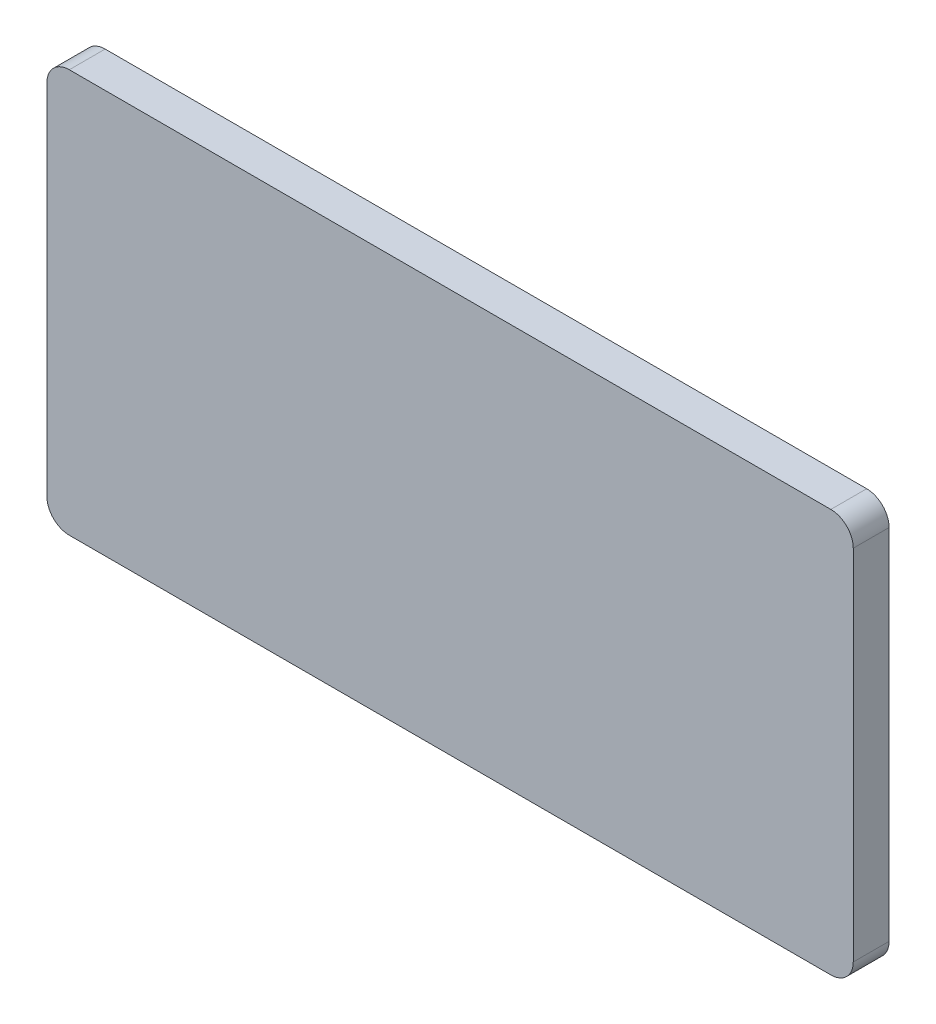
ISO-10303-21;
HEADER;
FILE_DESCRIPTION(('STEP AP214'),'2;1');
FILE_NAME('part.step','',(''),(''),'','','');
FILE_SCHEMA(('AUTOMOTIVE_DESIGN { 1 0 10303 214 1 1 1 1 }'));
ENDSEC;
DATA;
#1=APPLICATION_CONTEXT('core data for automotive mechanical design processes');
#2=APPLICATION_PROTOCOL_DEFINITION('international standard','automotive_design',2000,#1);
#3=PRODUCT_CONTEXT('',#1,'mechanical');
#4=PRODUCT('Part','Part','',(#3));
#5=PRODUCT_RELATED_PRODUCT_CATEGORY('part','',(#4));
#6=PRODUCT_DEFINITION_FORMATION('','',#4);
#7=PRODUCT_DEFINITION_CONTEXT('part definition',#1,'design');
#8=PRODUCT_DEFINITION('design','',#6,#7);
#9=PRODUCT_DEFINITION_SHAPE('','',#8);
#10=(LENGTH_UNIT() NAMED_UNIT(*) SI_UNIT(.MILLI.,.METRE.));
#11=(NAMED_UNIT(*) PLANE_ANGLE_UNIT() SI_UNIT($,.RADIAN.));
#12=(NAMED_UNIT(*) SI_UNIT($,.STERADIAN.) SOLID_ANGLE_UNIT());
#13=UNCERTAINTY_MEASURE_WITH_UNIT(LENGTH_MEASURE(1.E-05),#10,'distance_accuracy_value','');
#14=(GEOMETRIC_REPRESENTATION_CONTEXT(3) GLOBAL_UNCERTAINTY_ASSIGNED_CONTEXT((#13)) GLOBAL_UNIT_ASSIGNED_CONTEXT((#10,
#11,#12)) REPRESENTATION_CONTEXT('',''));
#15=CARTESIAN_POINT('',(0.,0.,0.));
#16=DIRECTION('',(0.,0.,1.));
#17=DIRECTION('',(1.,0.,0.));
#18=AXIS2_PLACEMENT_3D('',#15,#16,#17);
#19=CARTESIAN_POINT('',(900.,450.,80.));
#20=DIRECTION('',(-1.,0.,0.));
#21=DIRECTION('',(0.,0.,1.));
#22=AXIS2_PLACEMENT_3D('',#19,#20,#21);
#23=PLANE('',#22);
#24=DIRECTION('',(0.,1.,0.));
#25=VECTOR('',#24,1.);
#26=CARTESIAN_POINT('',(900.,450.,80.));
#27=LINE('',#26,#25);
#28=CARTESIAN_POINT('',(900.,-400.,80.));
#29=VERTEX_POINT('',#28);
#30=CARTESIAN_POINT('',(900.,400.,80.));
#31=VERTEX_POINT('',#30);
#32=EDGE_CURVE('E138',#29,#31,#27,.T.);
#33=ORIENTED_EDGE('',*,*,#32,.F.);
#34=DIRECTION('',(0.,0.,-1.));
#35=VECTOR('',#34,1.);
#36=CARTESIAN_POINT('',(900.,-400.,80.));
#37=LINE('',#36,#35);
#38=CARTESIAN_POINT('',(900.,-400.,0.));
#39=VERTEX_POINT('',#38);
#40=EDGE_CURVE('E122',#29,#39,#37,.T.);
#41=ORIENTED_EDGE('',*,*,#40,.T.);
#42=DIRECTION('',(0.,1.,0.));
#43=VECTOR('',#42,1.);
#44=CARTESIAN_POINT('',(900.,450.,0.));
#45=LINE('',#44,#43);
#46=CARTESIAN_POINT('',(900.,400.,0.));
#47=VERTEX_POINT('',#46);
#48=EDGE_CURVE('E135',#39,#47,#45,.T.);
#49=ORIENTED_EDGE('',*,*,#48,.T.);
#50=DIRECTION('',(0.,0.,-1.));
#51=VECTOR('',#50,1.);
#52=CARTESIAN_POINT('',(900.,400.,80.));
#53=LINE('',#52,#51);
#54=EDGE_CURVE('E141',#47,#31,#53,.F.);
#55=ORIENTED_EDGE('',*,*,#54,.T.);
#56=EDGE_LOOP('',(#33,#41,#49,#55));
#57=FACE_BOUND('',#56,.T.);
#58=ADVANCED_FACE('F51',(#57),#23,.F.);
#59=CARTESIAN_POINT('',(-900.,450.,80.));
#60=DIRECTION('',(0.,-1.,0.));
#61=DIRECTION('',(0.,0.,-1.));
#62=AXIS2_PLACEMENT_3D('',#59,#60,#61);
#63=PLANE('',#62);
#64=DIRECTION('',(-1.,0.,0.));
#65=VECTOR('',#64,1.);
#66=CARTESIAN_POINT('',(-900.,450.,0.));
#67=LINE('',#66,#65);
#68=CARTESIAN_POINT('',(850.,450.,0.));
#69=VERTEX_POINT('',#68);
#70=CARTESIAN_POINT('',(-850.,450.,0.));
#71=VERTEX_POINT('',#70);
#72=EDGE_CURVE('E146',#69,#71,#67,.T.);
#73=ORIENTED_EDGE('',*,*,#72,.T.);
#74=DIRECTION('',(0.,0.,-1.));
#75=VECTOR('',#74,1.);
#76=CARTESIAN_POINT('',(-850.,450.,80.));
#77=LINE('',#76,#75);
#78=CARTESIAN_POINT('',(-850.,450.,80.));
#79=VERTEX_POINT('',#78);
#80=EDGE_CURVE('E11',#71,#79,#77,.F.);
#81=ORIENTED_EDGE('',*,*,#80,.T.);
#82=DIRECTION('',(-1.,0.,0.));
#83=VECTOR('',#82,1.);
#84=CARTESIAN_POINT('',(-900.,450.,80.));
#85=LINE('',#84,#83);
#86=CARTESIAN_POINT('',(850.,450.,80.));
#87=VERTEX_POINT('',#86);
#88=EDGE_CURVE('E198',#87,#79,#85,.T.);
#89=ORIENTED_EDGE('',*,*,#88,.F.);
#90=DIRECTION('',(0.,0.,-1.));
#91=VECTOR('',#90,1.);
#92=CARTESIAN_POINT('',(850.,450.,80.));
#93=LINE('',#92,#91);
#94=EDGE_CURVE('E60',#87,#69,#93,.T.);
#95=ORIENTED_EDGE('',*,*,#94,.T.);
#96=EDGE_LOOP('',(#73,#81,#89,#95));
#97=FACE_BOUND('',#96,.T.);
#98=ADVANCED_FACE('F196',(#97),#63,.F.);
#99=CARTESIAN_POINT('',(-900.,450.,80.));
#100=DIRECTION('',(1.,0.,0.));
#101=DIRECTION('',(0.,0.,-1.));
#102=AXIS2_PLACEMENT_3D('',#99,#100,#101);
#103=PLANE('',#102);
#104=DIRECTION('',(0.,-1.,0.));
#105=VECTOR('',#104,1.);
#106=CARTESIAN_POINT('',(-900.,450.,0.));
#107=LINE('',#106,#105);
#108=CARTESIAN_POINT('',(-900.,400.,0.));
#109=VERTEX_POINT('',#108);
#110=CARTESIAN_POINT('',(-900.,-400.,0.));
#111=VERTEX_POINT('',#110);
#112=EDGE_CURVE('E150',#109,#111,#107,.T.);
#113=ORIENTED_EDGE('',*,*,#112,.T.);
#114=DIRECTION('',(0.,0.,-1.));
#115=VECTOR('',#114,1.);
#116=CARTESIAN_POINT('',(-900.,-400.,80.));
#117=LINE('',#116,#115);
#118=CARTESIAN_POINT('',(-900.,-400.,80.));
#119=VERTEX_POINT('',#118);
#120=EDGE_CURVE('E67',#111,#119,#117,.F.);
#121=ORIENTED_EDGE('',*,*,#120,.T.);
#122=DIRECTION('',(0.,-1.,0.));
#123=VECTOR('',#122,1.);
#124=CARTESIAN_POINT('',(-900.,450.,80.));
#125=LINE('',#124,#123);
#126=CARTESIAN_POINT('',(-900.,400.,80.));
#127=VERTEX_POINT('',#126);
#128=EDGE_CURVE('E206',#127,#119,#125,.T.);
#129=ORIENTED_EDGE('',*,*,#128,.F.);
#130=DIRECTION('',(0.,0.,-1.));
#131=VECTOR('',#130,1.);
#132=CARTESIAN_POINT('',(-900.,400.,80.));
#133=LINE('',#132,#131);
#134=EDGE_CURVE('E186',#127,#109,#133,.T.);
#135=ORIENTED_EDGE('',*,*,#134,.T.);
#136=EDGE_LOOP('',(#113,#121,#129,#135));
#137=FACE_BOUND('',#136,.T.);
#138=ADVANCED_FACE('F205',(#137),#103,.F.);
#139=CARTESIAN_POINT('',(-900.,-450.,80.));
#140=DIRECTION('',(0.,1.,0.));
#141=DIRECTION('',(0.,0.,1.));
#142=AXIS2_PLACEMENT_3D('',#139,#140,#141);
#143=PLANE('',#142);
#144=DIRECTION('',(1.,0.,0.));
#145=VECTOR('',#144,1.);
#146=CARTESIAN_POINT('',(-900.,-450.,0.));
#147=LINE('',#146,#145);
#148=CARTESIAN_POINT('',(-850.,-450.,0.));
#149=VERTEX_POINT('',#148);
#150=CARTESIAN_POINT('',(850.,-450.,0.));
#151=VERTEX_POINT('',#150);
#152=EDGE_CURVE('E158',#149,#151,#147,.T.);
#153=ORIENTED_EDGE('',*,*,#152,.T.);
#154=DIRECTION('',(0.,0.,-1.));
#155=VECTOR('',#154,1.);
#156=CARTESIAN_POINT('',(850.,-450.,80.));
#157=LINE('',#156,#155);
#158=CARTESIAN_POINT('',(850.,-450.,80.));
#159=VERTEX_POINT('',#158);
#160=EDGE_CURVE('E123',#151,#159,#157,.F.);
#161=ORIENTED_EDGE('',*,*,#160,.T.);
#162=DIRECTION('',(1.,0.,0.));
#163=VECTOR('',#162,1.);
#164=CARTESIAN_POINT('',(-900.,-450.,80.));
#165=LINE('',#164,#163);
#166=CARTESIAN_POINT('',(-850.,-450.,80.));
#167=VERTEX_POINT('',#166);
#168=EDGE_CURVE('E153',#167,#159,#165,.T.);
#169=ORIENTED_EDGE('',*,*,#168,.F.);
#170=DIRECTION('',(0.,0.,-1.));
#171=VECTOR('',#170,1.);
#172=CARTESIAN_POINT('',(-850.,-450.,80.));
#173=LINE('',#172,#171);
#174=EDGE_CURVE('E129',#167,#149,#173,.T.);
#175=ORIENTED_EDGE('',*,*,#174,.T.);
#176=EDGE_LOOP('',(#153,#161,#169,#175));
#177=FACE_BOUND('',#176,.T.);
#178=ADVANCED_FACE('F238',(#177),#143,.F.);
#179=CARTESIAN_POINT('',(0.,0.,80.));
#180=DIRECTION('',(0.,0.,1.));
#181=DIRECTION('',(1.,0.,0.));
#182=AXIS2_PLACEMENT_3D('',#179,#180,#181);
#183=PLANE('',#182);
#184=ORIENTED_EDGE('',*,*,#168,.T.);
#185=CARTESIAN_POINT('',(850.,-400.,80.));
#186=DIRECTION('',(0.,0.,1.));
#187=DIRECTION('',(1.,0.,0.));
#188=AXIS2_PLACEMENT_3D('',#185,#186,#187);
#189=CIRCLE('',#188,50.);
#190=EDGE_CURVE('E183',#159,#29,#189,.T.);
#191=ORIENTED_EDGE('',*,*,#190,.T.);
#192=ORIENTED_EDGE('',*,*,#32,.T.);
#193=CARTESIAN_POINT('',(850.,400.,80.));
#194=DIRECTION('',(0.,0.,1.));
#195=DIRECTION('',(1.,0.,0.));
#196=AXIS2_PLACEMENT_3D('',#193,#194,#195);
#197=CIRCLE('',#196,50.);
#198=EDGE_CURVE('E175',#31,#87,#197,.T.);
#199=ORIENTED_EDGE('',*,*,#198,.T.);
#200=ORIENTED_EDGE('',*,*,#88,.T.);
#201=CARTESIAN_POINT('',(-850.,400.,80.));
#202=DIRECTION('',(0.,0.,1.));
#203=DIRECTION('',(1.,0.,0.));
#204=AXIS2_PLACEMENT_3D('',#201,#202,#203);
#205=CIRCLE('',#204,50.);
#206=EDGE_CURVE('E74',#79,#127,#205,.T.);
#207=ORIENTED_EDGE('',*,*,#206,.T.);
#208=ORIENTED_EDGE('',*,*,#128,.T.);
#209=CARTESIAN_POINT('',(-850.,-400.,80.));
#210=DIRECTION('',(0.,0.,1.));
#211=DIRECTION('',(1.,0.,0.));
#212=AXIS2_PLACEMENT_3D('',#209,#210,#211);
#213=CIRCLE('',#212,50.);
#214=EDGE_CURVE('E180',#119,#167,#213,.T.);
#215=ORIENTED_EDGE('',*,*,#214,.T.);
#216=EDGE_LOOP('',(#184,#191,#192,#199,#200,#207,#208,#215));
#217=FACE_BOUND('',#216,.T.);
#218=ADVANCED_FACE('F215',(#217),#183,.T.);
#219=CARTESIAN_POINT('',(0.,0.,0.));
#220=DIRECTION('',(0.,0.,1.));
#221=DIRECTION('',(1.,0.,0.));
#222=AXIS2_PLACEMENT_3D('',#219,#220,#221);
#223=PLANE('',#222);
#224=ORIENTED_EDGE('',*,*,#48,.F.);
#225=CARTESIAN_POINT('',(850.,-400.,0.));
#226=DIRECTION('',(0.,0.,1.));
#227=DIRECTION('',(1.,0.,0.));
#228=AXIS2_PLACEMENT_3D('',#225,#226,#227);
#229=CIRCLE('',#228,50.);
#230=EDGE_CURVE('E118',#39,#151,#229,.F.);
#231=ORIENTED_EDGE('',*,*,#230,.T.);
#232=ORIENTED_EDGE('',*,*,#152,.F.);
#233=CARTESIAN_POINT('',(-850.,-400.,0.));
#234=DIRECTION('',(0.,0.,1.));
#235=DIRECTION('',(1.,0.,0.));
#236=AXIS2_PLACEMENT_3D('',#233,#234,#235);
#237=CIRCLE('',#236,50.);
#238=EDGE_CURVE('E130',#149,#111,#237,.F.);
#239=ORIENTED_EDGE('',*,*,#238,.T.);
#240=ORIENTED_EDGE('',*,*,#112,.F.);
#241=CARTESIAN_POINT('',(-850.,400.,0.));
#242=DIRECTION('',(0.,0.,1.));
#243=DIRECTION('',(1.,0.,0.));
#244=AXIS2_PLACEMENT_3D('',#241,#242,#243);
#245=CIRCLE('',#244,50.);
#246=EDGE_CURVE('E165',#109,#71,#245,.F.);
#247=ORIENTED_EDGE('',*,*,#246,.T.);
#248=ORIENTED_EDGE('',*,*,#72,.F.);
#249=CARTESIAN_POINT('',(850.,400.,0.));
#250=DIRECTION('',(0.,0.,1.));
#251=DIRECTION('',(1.,0.,0.));
#252=AXIS2_PLACEMENT_3D('',#249,#250,#251);
#253=CIRCLE('',#252,50.);
#254=EDGE_CURVE('E140',#69,#47,#253,.F.);
#255=ORIENTED_EDGE('',*,*,#254,.T.);
#256=EDGE_LOOP('',(#224,#231,#232,#239,#240,#247,#248,#255));
#257=FACE_BOUND('',#256,.T.);
#258=ADVANCED_FACE('F143',(#257),#223,.F.);
#259=CARTESIAN_POINT('',(850.,-400.,80.));
#260=DIRECTION('',(0.,0.,-1.));
#261=DIRECTION('',(-1.,0.,0.));
#262=AXIS2_PLACEMENT_3D('',#259,#260,#261);
#263=CYLINDRICAL_SURFACE('',#262,50.);
#264=ORIENTED_EDGE('',*,*,#190,.F.);
#265=ORIENTED_EDGE('',*,*,#160,.F.);
#266=ORIENTED_EDGE('',*,*,#230,.F.);
#267=ORIENTED_EDGE('',*,*,#40,.F.);
#268=EDGE_LOOP('',(#264,#265,#266,#267));
#269=FACE_BOUND('',#268,.T.);
#270=ADVANCED_FACE('F121',(#269),#263,.T.);
#271=CARTESIAN_POINT('',(-850.,-400.,80.));
#272=DIRECTION('',(0.,0.,-1.));
#273=DIRECTION('',(-1.,0.,0.));
#274=AXIS2_PLACEMENT_3D('',#271,#272,#273);
#275=CYLINDRICAL_SURFACE('',#274,50.);
#276=ORIENTED_EDGE('',*,*,#214,.F.);
#277=ORIENTED_EDGE('',*,*,#120,.F.);
#278=ORIENTED_EDGE('',*,*,#238,.F.);
#279=ORIENTED_EDGE('',*,*,#174,.F.);
#280=EDGE_LOOP('',(#276,#277,#278,#279));
#281=FACE_BOUND('',#280,.T.);
#282=ADVANCED_FACE('F220',(#281),#275,.T.);
#283=CARTESIAN_POINT('',(-850.,400.,80.));
#284=DIRECTION('',(0.,0.,-1.));
#285=DIRECTION('',(-1.,0.,0.));
#286=AXIS2_PLACEMENT_3D('',#283,#284,#285);
#287=CYLINDRICAL_SURFACE('',#286,50.);
#288=ORIENTED_EDGE('',*,*,#206,.F.);
#289=ORIENTED_EDGE('',*,*,#80,.F.);
#290=ORIENTED_EDGE('',*,*,#246,.F.);
#291=ORIENTED_EDGE('',*,*,#134,.F.);
#292=EDGE_LOOP('',(#288,#289,#290,#291));
#293=FACE_BOUND('',#292,.T.);
#294=ADVANCED_FACE('F204',(#293),#287,.T.);
#295=CARTESIAN_POINT('',(850.,400.,80.));
#296=DIRECTION('',(0.,0.,-1.));
#297=DIRECTION('',(-1.,0.,0.));
#298=AXIS2_PLACEMENT_3D('',#295,#296,#297);
#299=CYLINDRICAL_SURFACE('',#298,50.);
#300=ORIENTED_EDGE('',*,*,#198,.F.);
#301=ORIENTED_EDGE('',*,*,#54,.F.);
#302=ORIENTED_EDGE('',*,*,#254,.F.);
#303=ORIENTED_EDGE('',*,*,#94,.F.);
#304=EDGE_LOOP('',(#300,#301,#302,#303));
#305=FACE_BOUND('',#304,.T.);
#306=ADVANCED_FACE('F53',(#305),#299,.T.);
#307=CLOSED_SHELL('',(#58,#98,#138,#178,#218,#258,#270,#282,#294,#306));
#308=MANIFOLD_SOLID_BREP('B2',#307);
#309=ADVANCED_BREP_SHAPE_REPRESENTATION('',(#18,#308),#14);
#310=SHAPE_DEFINITION_REPRESENTATION(#9,#309);
ENDSEC;
END-ISO-10303-21;
